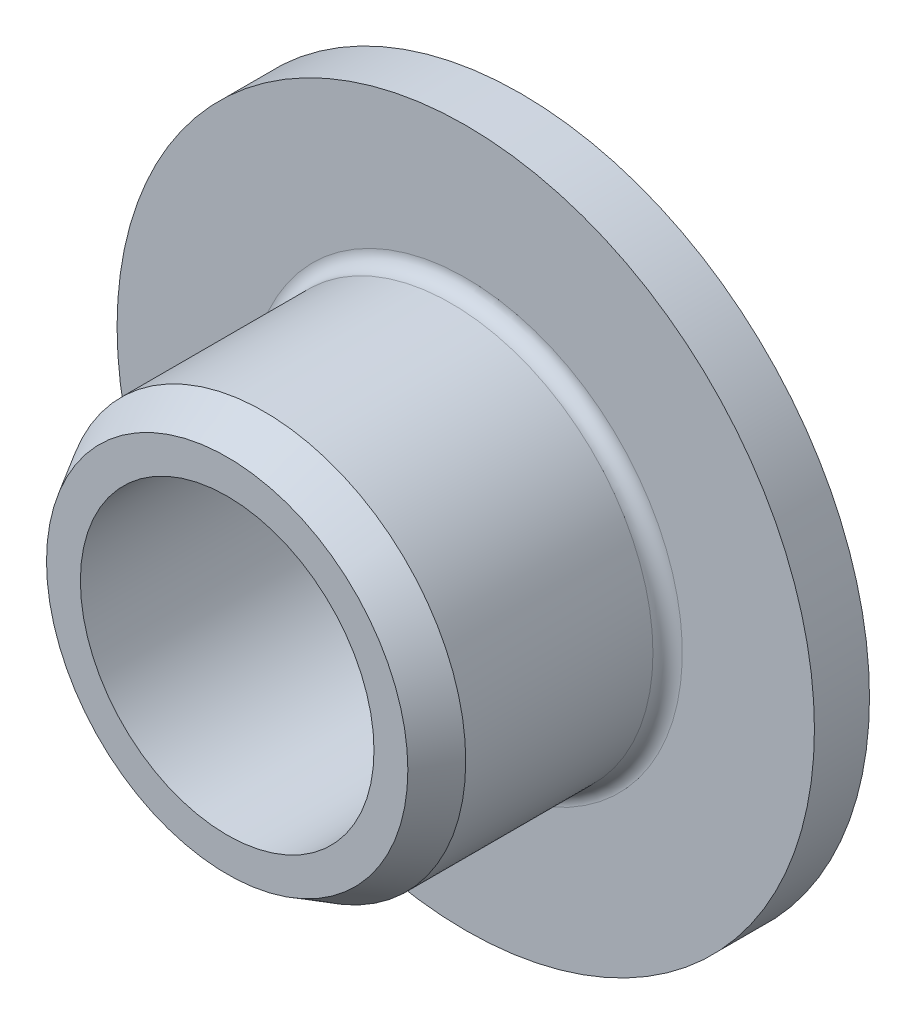
ISO-10303-21;
HEADER;
FILE_DESCRIPTION(('STEP AP214'),'2;1');
FILE_NAME('part.step','',(''),(''),'','','');
FILE_SCHEMA(('AUTOMOTIVE_DESIGN { 1 0 10303 214 1 1 1 1 }'));
ENDSEC;
DATA;
#1=APPLICATION_CONTEXT('core data for automotive mechanical design processes');
#2=APPLICATION_PROTOCOL_DEFINITION('international standard','automotive_design',2000,#1);
#3=PRODUCT_CONTEXT('',#1,'mechanical');
#4=PRODUCT('Part','Part','',(#3));
#5=PRODUCT_RELATED_PRODUCT_CATEGORY('part','',(#4));
#6=PRODUCT_DEFINITION_FORMATION('','',#4);
#7=PRODUCT_DEFINITION_CONTEXT('part definition',#1,'design');
#8=PRODUCT_DEFINITION('design','',#6,#7);
#9=PRODUCT_DEFINITION_SHAPE('','',#8);
#10=(LENGTH_UNIT() NAMED_UNIT(*) SI_UNIT(.MILLI.,.METRE.));
#11=(NAMED_UNIT(*) PLANE_ANGLE_UNIT() SI_UNIT($,.RADIAN.));
#12=(NAMED_UNIT(*) SI_UNIT($,.STERADIAN.) SOLID_ANGLE_UNIT());
#13=UNCERTAINTY_MEASURE_WITH_UNIT(LENGTH_MEASURE(1.E-05),#10,'distance_accuracy_value','');
#14=(GEOMETRIC_REPRESENTATION_CONTEXT(3) GLOBAL_UNCERTAINTY_ASSIGNED_CONTEXT((#13)) GLOBAL_UNIT_ASSIGNED_CONTEXT((#10,
#11,#12)) REPRESENTATION_CONTEXT('',''));
#15=CARTESIAN_POINT('',(0.,0.,0.));
#16=DIRECTION('',(0.,0.,1.));
#17=DIRECTION('',(1.,0.,0.));
#18=AXIS2_PLACEMENT_3D('',#15,#16,#17);
#19=CARTESIAN_POINT('',(0.,0.,4.));
#20=DIRECTION('',(0.,0.,-1.));
#21=DIRECTION('',(-1.,0.,0.));
#22=AXIS2_PLACEMENT_3D('',#19,#20,#21);
#23=CYLINDRICAL_SURFACE('',#22,2.75);
#24=CARTESIAN_POINT('',(0.,0.,3.5));
#25=DIRECTION('',(0.,0.,1.));
#26=DIRECTION('',(1.,0.,0.));
#27=AXIS2_PLACEMENT_3D('',#24,#25,#26);
#28=CIRCLE('',#27,2.75);
#29=CARTESIAN_POINT('',(2.75,0.,3.5));
#30=VERTEX_POINT('',#29);
#31=EDGE_CURVE('E10',#30,#30,#28,.F.);
#32=ORIENTED_EDGE('',*,*,#31,.T.);
#33=EDGE_LOOP('',(#32));
#34=FACE_BOUND('',#33,.T.);
#35=CARTESIAN_POINT('',(0.,0.,0.95));
#36=DIRECTION('',(0.,0.,-1.));
#37=DIRECTION('',(-1.,0.,0.));
#38=AXIS2_PLACEMENT_3D('',#35,#36,#37);
#39=CIRCLE('',#38,2.75);
#40=CARTESIAN_POINT('',(-2.75,0.,0.95));
#41=VERTEX_POINT('',#40);
#42=EDGE_CURVE('E46',#41,#41,#39,.F.);
#43=ORIENTED_EDGE('',*,*,#42,.T.);
#44=EDGE_LOOP('',(#43));
#45=FACE_BOUND('',#44,.T.);
#46=ADVANCED_FACE('F27',(#34,#45),#23,.T.);
#47=CARTESIAN_POINT('',(0.,0.,4.));
#48=DIRECTION('',(0.,0.,1.));
#49=DIRECTION('',(1.,0.,0.));
#50=AXIS2_PLACEMENT_3D('',#47,#48,#49);
#51=PLANE('',#50);
#52=CARTESIAN_POINT('',(0.,0.,4.));
#53=DIRECTION('',(0.,0.,1.));
#54=DIRECTION('',(1.,0.,0.));
#55=AXIS2_PLACEMENT_3D('',#52,#53,#54);
#56=CIRCLE('',#55,2.46132486540519);
#57=CARTESIAN_POINT('',(2.46132486540519,0.,4.));
#58=VERTEX_POINT('',#57);
#59=EDGE_CURVE('E33',#58,#58,#56,.T.);
#60=ORIENTED_EDGE('',*,*,#59,.T.);
#61=EDGE_LOOP('',(#60));
#62=FACE_BOUND('',#61,.T.);
#63=CARTESIAN_POINT('',(0.,0.,4.));
#64=DIRECTION('',(0.,0.,1.));
#65=DIRECTION('',(1.,0.,0.));
#66=AXIS2_PLACEMENT_3D('',#63,#64,#65);
#67=CIRCLE('',#66,2.);
#68=CARTESIAN_POINT('',(2.,0.,4.));
#69=VERTEX_POINT('',#68);
#70=EDGE_CURVE('E52',#69,#69,#67,.T.);
#71=ORIENTED_EDGE('',*,*,#70,.F.);
#72=EDGE_LOOP('',(#71));
#73=FACE_BOUND('',#72,.T.);
#74=ADVANCED_FACE('F80',(#62,#73),#51,.T.);
#75=CARTESIAN_POINT('',(0.,0.,0.));
#76=DIRECTION('',(0.,0.,1.));
#77=DIRECTION('',(1.,0.,0.));
#78=AXIS2_PLACEMENT_3D('',#75,#76,#77);
#79=PLANE('',#78);
#80=CARTESIAN_POINT('',(0.,0.,0.));
#81=DIRECTION('',(0.,0.,1.));
#82=DIRECTION('',(1.,0.,0.));
#83=AXIS2_PLACEMENT_3D('',#80,#81,#82);
#84=CIRCLE('',#83,2.28867513459481);
#85=CARTESIAN_POINT('',(2.28867513459481,0.,0.));
#86=VERTEX_POINT('',#85);
#87=EDGE_CURVE('E41',#86,#86,#84,.T.);
#88=ORIENTED_EDGE('',*,*,#87,.T.);
#89=EDGE_LOOP('',(#88));
#90=FACE_BOUND('',#89,.T.);
#91=CARTESIAN_POINT('',(0.,0.,0.));
#92=DIRECTION('',(0.,0.,-1.));
#93=DIRECTION('',(-1.,0.,0.));
#94=AXIS2_PLACEMENT_3D('',#91,#92,#93);
#95=CIRCLE('',#94,4.75);
#96=CARTESIAN_POINT('',(-4.75,0.,0.));
#97=VERTEX_POINT('',#96);
#98=EDGE_CURVE('E58',#97,#97,#95,.T.);
#99=ORIENTED_EDGE('',*,*,#98,.T.);
#100=EDGE_LOOP('',(#99));
#101=FACE_BOUND('',#100,.T.);
#102=ADVANCED_FACE('F62',(#90,#101),#79,.F.);
#103=CARTESIAN_POINT('',(0.,0.,4.));
#104=DIRECTION('',(0.,0.,-1.));
#105=DIRECTION('',(-1.,0.,0.));
#106=AXIS2_PLACEMENT_3D('',#103,#104,#105);
#107=CYLINDRICAL_SURFACE('',#106,2.);
#108=CARTESIAN_POINT('',(0.,0.,0.500000000000003));
#109=DIRECTION('',(0.,0.,1.));
#110=DIRECTION('',(1.,0.,0.));
#111=AXIS2_PLACEMENT_3D('',#108,#109,#110);
#112=CIRCLE('',#111,2.);
#113=CARTESIAN_POINT('',(2.,0.,0.500000000000003));
#114=VERTEX_POINT('',#113);
#115=EDGE_CURVE('E37',#114,#114,#112,.F.);
#116=ORIENTED_EDGE('',*,*,#115,.T.);
#117=EDGE_LOOP('',(#116));
#118=FACE_BOUND('',#117,.T.);
#119=ORIENTED_EDGE('',*,*,#70,.T.);
#120=EDGE_LOOP('',(#119));
#121=FACE_BOUND('',#120,.T.);
#122=ADVANCED_FACE('F67',(#118,#121),#107,.F.);
#123=CARTESIAN_POINT('',(0.,0.,0.75));
#124=DIRECTION('',(0.,0.,-1.));
#125=DIRECTION('',(-1.,0.,0.));
#126=AXIS2_PLACEMENT_3D('',#123,#124,#125);
#127=CYLINDRICAL_SURFACE('',#126,4.75);
#128=CARTESIAN_POINT('',(0.,0.,0.75));
#129=DIRECTION('',(0.,0.,-1.));
#130=DIRECTION('',(-1.,0.,0.));
#131=AXIS2_PLACEMENT_3D('',#128,#129,#130);
#132=CIRCLE('',#131,4.75);
#133=CARTESIAN_POINT('',(-4.75,0.,0.75));
#134=VERTEX_POINT('',#133);
#135=EDGE_CURVE('E55',#134,#134,#132,.T.);
#136=ORIENTED_EDGE('',*,*,#135,.T.);
#137=EDGE_LOOP('',(#136));
#138=FACE_BOUND('',#137,.T.);
#139=ORIENTED_EDGE('',*,*,#98,.F.);
#140=EDGE_LOOP('',(#139));
#141=FACE_BOUND('',#140,.T.);
#142=ADVANCED_FACE('F64',(#138,#141),#127,.T.);
#143=CARTESIAN_POINT('',(0.,0.,0.75));
#144=DIRECTION('',(0.,0.,-1.));
#145=DIRECTION('',(-1.,0.,0.));
#146=AXIS2_PLACEMENT_3D('',#143,#144,#145);
#147=PLANE('',#146);
#148=CARTESIAN_POINT('',(0.,0.,0.75));
#149=DIRECTION('',(0.,0.,-1.));
#150=DIRECTION('',(-1.,0.,0.));
#151=AXIS2_PLACEMENT_3D('',#148,#149,#150);
#152=CIRCLE('',#151,2.95);
#153=CARTESIAN_POINT('',(-2.95,0.,0.75));
#154=VERTEX_POINT('',#153);
#155=EDGE_CURVE('E49',#154,#154,#152,.T.);
#156=ORIENTED_EDGE('',*,*,#155,.T.);
#157=EDGE_LOOP('',(#156));
#158=FACE_BOUND('',#157,.T.);
#159=ORIENTED_EDGE('',*,*,#135,.F.);
#160=EDGE_LOOP('',(#159));
#161=FACE_BOUND('',#160,.T.);
#162=ADVANCED_FACE('F66',(#158,#161),#147,.F.);
#163=CARTESIAN_POINT('',(0.,0.,0.95));
#164=DIRECTION('',(0.,0.,-1.));
#165=DIRECTION('',(-1.,0.,0.));
#166=AXIS2_PLACEMENT_3D('',#163,#164,#165);
#167=TOROIDAL_SURFACE('',#166,2.95,0.2);
#168=ORIENTED_EDGE('',*,*,#42,.F.);
#169=EDGE_LOOP('',(#168));
#170=FACE_BOUND('',#169,.T.);
#171=ORIENTED_EDGE('',*,*,#155,.F.);
#172=EDGE_LOOP('',(#171));
#173=FACE_BOUND('',#172,.T.);
#174=ADVANCED_FACE('F73',(#170,#173),#167,.F.);
#175=CARTESIAN_POINT('',(0.,0.,0.));
#176=DIRECTION('',(0.,0.,-1.));
#177=DIRECTION('',(-1.,0.,0.));
#178=AXIS2_PLACEMENT_3D('',#175,#176,#177);
#179=CONICAL_SURFACE('',#178,2.28867513459481,0.523598775598296);
#180=ORIENTED_EDGE('',*,*,#115,.F.);
#181=EDGE_LOOP('',(#180));
#182=FACE_BOUND('',#181,.T.);
#183=ORIENTED_EDGE('',*,*,#87,.F.);
#184=EDGE_LOOP('',(#183));
#185=FACE_BOUND('',#184,.T.);
#186=ADVANCED_FACE('F90',(#182,#185),#179,.F.);
#187=CARTESIAN_POINT('',(0.,0.,4.));
#188=DIRECTION('',(0.,0.,-1.));
#189=DIRECTION('',(-1.,0.,0.));
#190=AXIS2_PLACEMENT_3D('',#187,#188,#189);
#191=CONICAL_SURFACE('',#190,2.46132486540519,0.523598775598296);
#192=ORIENTED_EDGE('',*,*,#31,.F.);
#193=EDGE_LOOP('',(#192));
#194=FACE_BOUND('',#193,.T.);
#195=ORIENTED_EDGE('',*,*,#59,.F.);
#196=EDGE_LOOP('',(#195));
#197=FACE_BOUND('',#196,.T.);
#198=ADVANCED_FACE('F98',(#194,#197),#191,.T.);
#199=CLOSED_SHELL('',(#46,#74,#102,#122,#142,#162,#174,#186,#198));
#200=MANIFOLD_SOLID_BREP('B2',#199);
#201=ADVANCED_BREP_SHAPE_REPRESENTATION('',(#18,#200),#14);
#202=SHAPE_DEFINITION_REPRESENTATION(#9,#201);
ENDSEC;
END-ISO-10303-21;
